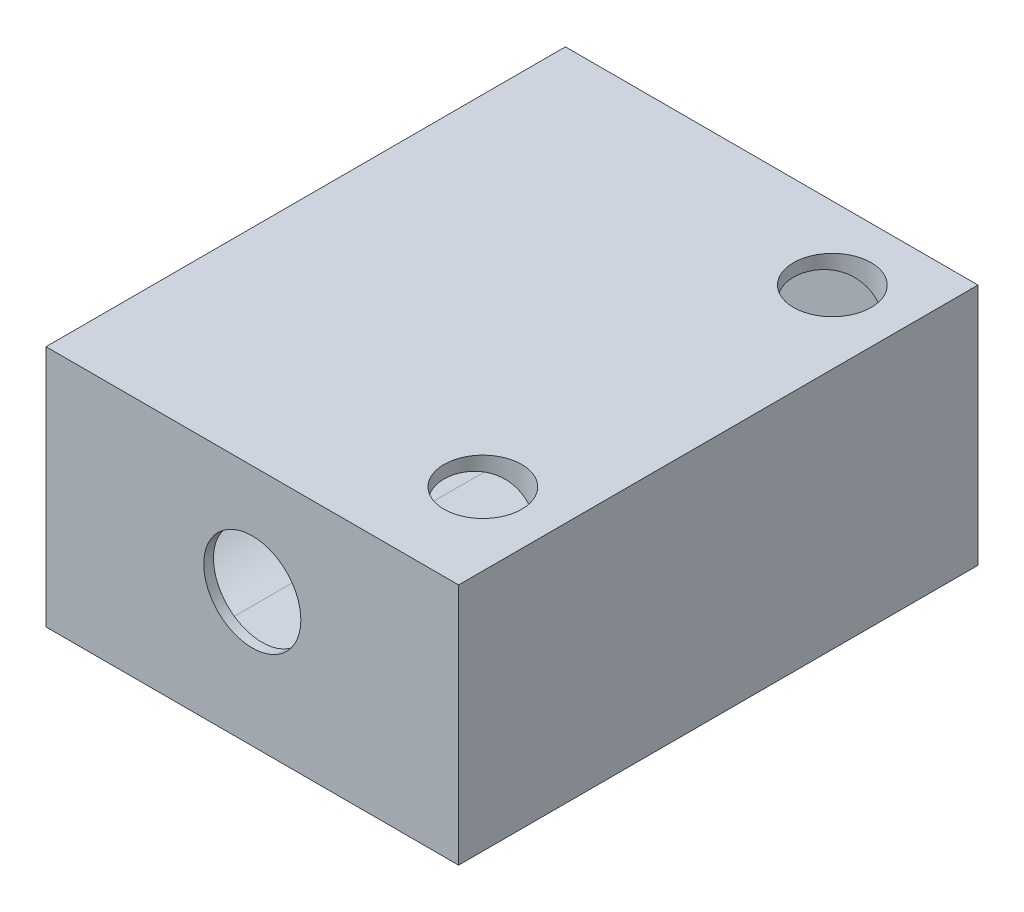
ISO-10303-21;
HEADER;
FILE_DESCRIPTION(('STEP AP214'),'2;1');
FILE_NAME('part.step','',(''),(''),'','','');
FILE_SCHEMA(('AUTOMOTIVE_DESIGN { 1 0 10303 214 1 1 1 1 }'));
ENDSEC;
DATA;
#1=APPLICATION_CONTEXT('core data for automotive mechanical design processes');
#2=APPLICATION_PROTOCOL_DEFINITION('international standard','automotive_design',2000,#1);
#3=PRODUCT_CONTEXT('',#1,'mechanical');
#4=PRODUCT('Part','Part','',(#3));
#5=PRODUCT_RELATED_PRODUCT_CATEGORY('part','',(#4));
#6=PRODUCT_DEFINITION_FORMATION('','',#4);
#7=PRODUCT_DEFINITION_CONTEXT('part definition',#1,'design');
#8=PRODUCT_DEFINITION('design','',#6,#7);
#9=PRODUCT_DEFINITION_SHAPE('','',#8);
#10=(LENGTH_UNIT() NAMED_UNIT(*) SI_UNIT(.MILLI.,.METRE.));
#11=(NAMED_UNIT(*) PLANE_ANGLE_UNIT() SI_UNIT($,.RADIAN.));
#12=(NAMED_UNIT(*) SI_UNIT($,.STERADIAN.) SOLID_ANGLE_UNIT());
#13=UNCERTAINTY_MEASURE_WITH_UNIT(LENGTH_MEASURE(1.E-05),#10,'distance_accuracy_value','');
#14=(GEOMETRIC_REPRESENTATION_CONTEXT(3) GLOBAL_UNCERTAINTY_ASSIGNED_CONTEXT((#13)) GLOBAL_UNIT_ASSIGNED_CONTEXT((#10,
#11,#12)) REPRESENTATION_CONTEXT('',''));
#15=CARTESIAN_POINT('',(0.,0.,0.));
#16=DIRECTION('',(0.,0.,1.));
#17=DIRECTION('',(1.,0.,0.));
#18=AXIS2_PLACEMENT_3D('',#15,#16,#17);
#19=CARTESIAN_POINT('',(0.,63.5,133.35));
#20=DIRECTION('',(0.,-1.,0.));
#21=DIRECTION('',(0.,0.,-1.));
#22=AXIS2_PLACEMENT_3D('',#19,#20,#21);
#23=PLANE('',#22);
#24=DIRECTION('',(0.,0.,-1.));
#25=VECTOR('',#24,1.);
#26=CARTESIAN_POINT('',(107.95,63.5,133.35));
#27=LINE('',#26,#25);
#28=CARTESIAN_POINT('',(107.95,63.5,135.89));
#29=VERTEX_POINT('',#28);
#30=CARTESIAN_POINT('',(107.95,63.5,0.));
#31=VERTEX_POINT('',#30);
#32=EDGE_CURVE('E58',#29,#31,#27,.T.);
#33=ORIENTED_EDGE('',*,*,#32,.T.);
#34=DIRECTION('',(-1.,0.,0.));
#35=VECTOR('',#34,1.);
#36=CARTESIAN_POINT('',(0.,63.5,0.));
#37=LINE('',#36,#35);
#38=CARTESIAN_POINT('',(0.,63.5,0.));
#39=VERTEX_POINT('',#38);
#40=EDGE_CURVE('E168',#31,#39,#37,.T.);
#41=ORIENTED_EDGE('',*,*,#40,.T.);
#42=DIRECTION('',(0.,0.,-1.));
#43=VECTOR('',#42,1.);
#44=CARTESIAN_POINT('',(0.,63.5,133.35));
#45=LINE('',#44,#43);
#46=CARTESIAN_POINT('',(0.,63.5,135.89));
#47=VERTEX_POINT('',#46);
#48=EDGE_CURVE('E51',#47,#39,#45,.T.);
#49=ORIENTED_EDGE('',*,*,#48,.F.);
#50=DIRECTION('',(-1.,0.,0.));
#51=VECTOR('',#50,1.);
#52=CARTESIAN_POINT('',(0.,63.5,135.89));
#53=LINE('',#52,#51);
#54=EDGE_CURVE('E117',#29,#47,#53,.T.);
#55=ORIENTED_EDGE('',*,*,#54,.F.);
#56=EDGE_LOOP('',(#33,#41,#49,#55));
#57=FACE_BOUND('',#56,.T.);
#58=CARTESIAN_POINT('',(88.9,63.5,19.05));
#59=DIRECTION('',(0.,-1.,0.));
#60=DIRECTION('',(0.,0.,-1.));
#61=AXIS2_PLACEMENT_3D('',#58,#59,#60);
#62=CIRCLE('',#61,10.16);
#63=CARTESIAN_POINT('',(88.9,63.5,8.89000000000001));
#64=VERTEX_POINT('',#63);
#65=EDGE_CURVE('E184',#64,#64,#62,.T.);
#66=ORIENTED_EDGE('',*,*,#65,.T.);
#67=EDGE_LOOP('',(#66));
#68=FACE_BOUND('',#67,.T.);
#69=CARTESIAN_POINT('',(88.9,63.5,110.49));
#70=DIRECTION('',(0.,-1.,0.));
#71=DIRECTION('',(0.,0.,-1.));
#72=AXIS2_PLACEMENT_3D('',#69,#70,#71);
#73=CIRCLE('',#72,10.16);
#74=CARTESIAN_POINT('',(88.9,63.5,100.33));
#75=VERTEX_POINT('',#74);
#76=EDGE_CURVE('E187',#75,#75,#73,.T.);
#77=ORIENTED_EDGE('',*,*,#76,.T.);
#78=EDGE_LOOP('',(#77));
#79=FACE_BOUND('',#78,.T.);
#80=ADVANCED_FACE('F36',(#57,#68,#79),#23,.F.);
#81=CARTESIAN_POINT('',(76.2,34.925,5.08));
#82=DIRECTION('',(0.,0.,1.));
#83=DIRECTION('',(1.,0.,0.));
#84=AXIS2_PLACEMENT_3D('',#81,#82,#83);
#85=CYLINDRICAL_SURFACE('',#84,25.4);
#86=CARTESIAN_POINT('',(76.2,34.925,133.35));
#87=DIRECTION('',(0.,0.,1.));
#88=DIRECTION('',(1.,0.,0.));
#89=AXIS2_PLACEMENT_3D('',#86,#87,#88);
#90=CIRCLE('',#89,25.4);
#91=CARTESIAN_POINT('',(76.2,9.525,133.35));
#92=VERTEX_POINT('',#91);
#93=CARTESIAN_POINT('',(76.2,60.325,133.35));
#94=VERTEX_POINT('',#93);
#95=EDGE_CURVE('E147',#92,#94,#90,.T.);
#96=ORIENTED_EDGE('',*,*,#95,.T.);
#97=DIRECTION('',(0.,0.,1.));
#98=VECTOR('',#97,1.);
#99=CARTESIAN_POINT('',(76.2,60.325,5.08));
#100=LINE('',#99,#98);
#101=CARTESIAN_POINT('',(76.2,60.325,5.08));
#102=VERTEX_POINT('',#101);
#103=EDGE_CURVE('E155',#102,#94,#100,.T.);
#104=ORIENTED_EDGE('',*,*,#103,.F.);
#105=CARTESIAN_POINT('',(76.2,34.925,5.08));
#106=DIRECTION('',(0.,0.,1.));
#107=DIRECTION('',(1.,0.,0.));
#108=AXIS2_PLACEMENT_3D('',#105,#106,#107);
#109=CIRCLE('',#108,25.4);
#110=CARTESIAN_POINT('',(76.2,9.525,5.08));
#111=VERTEX_POINT('',#110);
#112=EDGE_CURVE('E135',#111,#102,#109,.T.);
#113=ORIENTED_EDGE('',*,*,#112,.F.);
#114=DIRECTION('',(0.,0.,1.));
#115=VECTOR('',#114,1.);
#116=CARTESIAN_POINT('',(76.2,9.525,5.08));
#117=LINE('',#116,#115);
#118=EDGE_CURVE('E158',#111,#92,#117,.T.);
#119=ORIENTED_EDGE('',*,*,#118,.T.);
#120=EDGE_LOOP('',(#96,#104,#113,#119));
#121=FACE_BOUND('',#120,.T.);
#122=CARTESIAN_POINT('',(88.9,56.9220452561247,29.21));
#123=CARTESIAN_POINT('',(89.2756064943384,56.7051828705063,29.2099971108957));
#124=CARTESIAN_POINT('',(89.6457040129703,56.4786402854941,29.1891538820678));
#125=CARTESIAN_POINT('',(90.3709839206902,56.0088848283402,29.1095761465608));
#126=CARTESIAN_POINT('',(90.7261589274956,55.765663858291,29.0508231153214));
#127=CARTESIAN_POINT('',(91.41968340898,55.2647303194378,28.8990145423729));
#128=CARTESIAN_POINT('',(91.7579925678835,55.0069858963736,28.8058808985446));
#129=CARTESIAN_POINT('',(92.4151930823998,54.480176888362,28.5888050191749));
#130=CARTESIAN_POINT('',(92.7340857910189,54.2111130944026,28.4648649334003));
#131=CARTESIAN_POINT('',(93.3890746049134,53.63087234748,28.1723704769345));
#132=CARTESIAN_POINT('',(93.7225502878889,53.3185518145697,28.0002243695954));
#133=CARTESIAN_POINT('',(94.363261393526,52.6861552742099,27.6241722844393));
#134=CARTESIAN_POINT('',(94.6704901249804,52.3660773156771,27.4202582451249));
#135=CARTESIAN_POINT('',(95.2584064363175,51.7216492867779,26.9828785151929));
#136=CARTESIAN_POINT('',(95.5390873389074,51.397298164876,26.7494054242512));
#137=CARTESIAN_POINT('',(96.0735652993716,50.7483342516919,26.2540514584397));
#138=CARTESIAN_POINT('',(96.3273714984814,50.4237215874721,25.9921803047103));
#139=CARTESIAN_POINT('',(96.7374579953752,49.8733702170923,25.5204596688597));
#140=CARTESIAN_POINT('',(96.9005443807741,49.6464934017825,25.3178095435435));
#141=CARTESIAN_POINT('',(97.2128405661613,49.1971872244416,24.8972996835076));
#142=CARTESIAN_POINT('',(97.362048562285,48.9747584434917,24.6794379780645));
#143=CARTESIAN_POINT('',(97.6456460428541,48.5379305257614,24.2278580150196));
#144=CARTESIAN_POINT('',(97.7800712215749,48.3235129113706,23.9941802556868));
#145=CARTESIAN_POINT('',(98.0334588131405,47.9065062324312,23.5087520361313));
#146=CARTESIAN_POINT('',(98.1524313888686,47.7039094423448,23.2570136249382));
#147=CARTESIAN_POINT('',(98.3766110667288,47.3109003337332,22.7249559196767));
#148=CARTESIAN_POINT('',(98.4813014506497,47.1210320207692,22.4440079132311));
#149=CARTESIAN_POINT('',(98.669332408164,46.7710304828614,21.8572314294573));
#150=CARTESIAN_POINT('',(98.7526917768122,46.6108711154264,21.5514251703704));
#151=CARTESIAN_POINT('',(98.8791923246017,46.3630874445159,20.9761070863874));
#152=CARTESIAN_POINT('',(98.9270146680982,46.2673980036928,20.7112375381001));
#153=CARTESIAN_POINT('',(98.9832850228293,46.1536995731761,20.3037181706426));
#154=CARTESIAN_POINT('',(98.9994613027101,46.1207797766696,20.1662317095338));
#155=CARTESIAN_POINT('',(99.0262927906815,46.0659738690749,19.8885755414238));
#156=CARTESIAN_POINT('',(99.0369507464435,46.0440822670005,19.7484072058979));
#157=CARTESIAN_POINT('',(99.0525155058693,46.0120581828956,19.4651280654644));
#158=CARTESIAN_POINT('',(99.0573699743768,46.0020327161812,19.3220021526617));
#159=CARTESIAN_POINT('',(99.0610003509738,45.9945384593369,19.0353445437131));
#160=CARTESIAN_POINT('',(99.0597764490076,45.9970692768328,18.8918128603872));
#161=CARTESIAN_POINT('',(99.0512868837509,46.0145797815046,18.6056041119924));
#162=CARTESIAN_POINT('',(99.0440172029994,46.0295677465356,18.462927678758));
#163=CARTESIAN_POINT('',(99.0236564733302,46.0713554029627,18.179744714585));
#164=CARTESIAN_POINT('',(99.010564660355,46.0981566446499,18.0392384709527));
#165=CARTESIAN_POINT('',(98.9766209760811,46.1672071039272,17.7412040278355));
#166=CARTESIAN_POINT('',(98.9549189620956,46.2111331490899,17.5841629239453));
#167=CARTESIAN_POINT('',(98.9049832254668,46.3112573976683,17.2750463901184));
#168=CARTESIAN_POINT('',(98.8767446997546,46.36746462366,17.1229747059729));
#169=CARTESIAN_POINT('',(98.8143391343334,46.4903106984,16.824052377869));
#170=CARTESIAN_POINT('',(98.7801608501946,46.5569693085989,16.6772122847813));
#171=CARTESIAN_POINT('',(98.7065155467252,46.6988336360371,16.389183395694));
#172=CARTESIAN_POINT('',(98.667049555823,46.774037690806,16.2479935076798));
#173=CARTESIAN_POINT('',(98.5525245034215,46.9893474630746,15.8692055035002));
#174=CARTESIAN_POINT('',(98.47263437552,47.1365098074085,15.6370678623276));
#175=CARTESIAN_POINT('',(98.3003496506784,47.4456208915507,15.1877498531487));
#176=CARTESIAN_POINT('',(98.2079454543645,47.6075809511498,14.9705811625127));
#177=CARTESIAN_POINT('',(98.0116698721126,47.9422500395963,14.5491990583053));
#178=CARTESIAN_POINT('',(97.9077694264238,48.1149858034193,14.3450206295346));
#179=CARTESIAN_POINT('',(97.689534691375,48.4676331657081,13.9489421411727));
#180=CARTESIAN_POINT('',(97.5752021427711,48.6475435641661,13.7570400421459));
#181=CARTESIAN_POINT('',(97.3536199153307,48.9862692446863,13.4110407760062));
#182=CARTESIAN_POINT('',(97.2476862836542,49.1444329066395,13.255455664535));
#183=CARTESIAN_POINT('',(97.028709249952,49.4633051324441,12.9520765419754));
#184=CARTESIAN_POINT('',(96.9156649906126,49.6240140014113,12.8042834743218));
#185=CARTESIAN_POINT('',(96.5659650994769,50.1087431654909,12.3719623744887));
#186=CARTESIAN_POINT('',(96.3188105101,50.4352608704305,12.0985980821109));
#187=CARTESIAN_POINT('',(95.7972414777195,51.0892590857281,11.5808244154494));
#188=CARTESIAN_POINT('',(95.5228300220551,51.4167394867657,11.3364118744916));
#189=CARTESIAN_POINT('',(94.9469803042436,52.0685030692007,10.8771691977255));
#190=CARTESIAN_POINT('',(94.645552097278,52.3927873906574,10.6623281307802));
#191=CARTESIAN_POINT('',(94.0618947428393,52.9876726422036,10.2931981468793));
#192=CARTESIAN_POINT('',(93.7832938555874,53.2591952791736,10.1346483625132));
#193=CARTESIAN_POINT('',(93.2068263863727,53.7951536822748,9.84232512593481));
#194=CARTESIAN_POINT('',(92.9089592020441,54.0595892264603,9.70855244889102));
#195=CARTESIAN_POINT('',(92.2951403543418,54.5786957670121,9.46840048898047));
#196=CARTESIAN_POINT('',(91.9792196428485,54.8333822954789,9.36197594511035));
#197=CARTESIAN_POINT('',(91.330008895249,55.3311261505632,9.17911813065657));
#198=CARTESIAN_POINT('',(90.9967232699172,55.5741864005168,9.10267728573027));
#199=CARTESIAN_POINT('',(90.3878902171245,55.9955939067846,8.99586097222574));
#200=CARTESIAN_POINT('',(90.1153112364065,56.176630138223,8.95911863187853));
#201=CARTESIAN_POINT('',(89.5618741625214,56.5288847547407,8.90777545245065));
#202=CARTESIAN_POINT('',(89.2810179119022,56.7001053002014,8.89316972307568));
#203=CARTESIAN_POINT('',(88.7126869350535,57.0315796288272,8.88775356474215));
#204=CARTESIAN_POINT('',(88.4252130016917,57.1918347167235,8.89694029975242));
#205=CARTESIAN_POINT('',(87.8457234870526,57.5003149992494,8.94067176643667));
#206=CARTESIAN_POINT('',(87.5537078353816,57.6485400071987,8.97521689153299));
#207=CARTESIAN_POINT('',(86.9654124943004,57.9331177597402,9.07139851172101));
#208=CARTESIAN_POINT('',(86.6691173308218,58.0693680024776,9.13324586422569));
#209=CARTESIAN_POINT('',(86.0776188941102,58.3279232720227,9.28511484375721));
#210=CARTESIAN_POINT('',(85.782415638648,58.4502280728252,9.37513692730591));
#211=CARTESIAN_POINT('',(85.1967203153096,58.6803779641358,9.58385438195323));
#212=CARTESIAN_POINT('',(84.9062257916169,58.7882308202307,9.7025342572672));
#213=CARTESIAN_POINT('',(84.3334874821739,58.9894653153909,9.96857833251592));
#214=CARTESIAN_POINT('',(84.051242542596,59.082848986122,10.1159384987891));
#215=CARTESIAN_POINT('',(83.5342884388332,59.2443726054499,10.4179377581312));
#216=CARTESIAN_POINT('',(83.2981334280004,59.3142144967355,10.5692046489652));
#217=CARTESIAN_POINT('',(82.8373352556371,59.4436263883745,10.892252470913));
#218=CARTESIAN_POINT('',(82.612691018762,59.5031973494797,11.0640314807582));
#219=CARTESIAN_POINT('',(82.1772200471305,59.6127148391075,11.4269971910049));
#220=CARTESIAN_POINT('',(81.9663913349927,59.6626627469476,11.6181811040031));
#221=CARTESIAN_POINT('',(81.5606041741748,59.7537570445246,12.0186331195242));
#222=CARTESIAN_POINT('',(81.3656456348606,59.7949034845286,12.2279011187555));
#223=CARTESIAN_POINT('',(81.0024347416304,59.8675192169474,12.6524753915717));
#224=CARTESIAN_POINT('',(80.833348650777,59.8993589470173,12.8670063103296));
#225=CARTESIAN_POINT('',(80.5126631454301,59.9567294117257,13.3095431744139));
#226=CARTESIAN_POINT('',(80.3610629840792,59.9822604158751,13.5375485435911));
#227=CARTESIAN_POINT('',(80.0765573680894,60.0278498219865,14.0054550575945));
#228=CARTESIAN_POINT('',(79.9436519433405,60.0479082151987,14.2453562214394));
#229=CARTESIAN_POINT('',(79.6975545144224,60.0833500132714,14.7353994518322));
#230=CARTESIAN_POINT('',(79.584362972459,60.0987333085273,14.985541758321));
#231=CARTESIAN_POINT('',(79.3769153075623,60.1257605381,15.4983580188325));
#232=CARTESIAN_POINT('',(79.2829854321114,60.1373417734672,15.761167282155));
#233=CARTESIAN_POINT('',(79.1170343667734,60.1570807370006,16.2937381613989));
#234=CARTESIAN_POINT('',(79.045013319039,60.1652384429538,16.5634998224177));
#235=CARTESIAN_POINT('',(78.9233984981144,60.1786501955276,17.1081246123851));
#236=CARTESIAN_POINT('',(78.873806495892,60.1839040128683,17.3829881423873));
#237=CARTESIAN_POINT('',(78.7974125488634,60.1918740591546,17.9359010622974));
#238=CARTESIAN_POINT('',(78.7706107973335,60.1945902665797,18.2139504792033));
#239=CARTESIAN_POINT('',(78.7397546132745,60.1977104880273,18.7755783276775));
#240=CARTESIAN_POINT('',(78.7360532651692,60.198078614014,19.0591764185212));
#241=CARTESIAN_POINT('',(78.7523653815551,60.1964363770043,19.625685043111));
#242=CARTESIAN_POINT('',(78.7723791148863,60.1944259870446,19.9085955690263));
#243=CARTESIAN_POINT('',(78.8359773848197,60.1878708395569,20.4717405371529));
#244=CARTESIAN_POINT('',(78.8795631109675,60.1833259541269,20.7519748435843));
#245=CARTESIAN_POINT('',(78.9899858416449,60.1713672362724,21.3077626537361));
#246=CARTESIAN_POINT('',(79.0568228089594,60.1639534084398,21.5833161649478));
#247=CARTESIAN_POINT('',(79.2134250516176,60.1457353545876,22.1283842695534));
#248=CARTESIAN_POINT('',(79.3032412359694,60.1349235883429,22.3978839901229));
#249=CARTESIAN_POINT('',(79.5050424270874,60.1092615970078,22.9282567902022));
#250=CARTESIAN_POINT('',(79.6170275149741,60.0944113571397,23.1891298381412));
#251=CARTESIAN_POINT('',(79.8622793665319,60.0598967494068,23.700329966551));
#252=CARTESIAN_POINT('',(79.9955451555955,60.040232601986,23.9506575293178));
#253=CARTESIAN_POINT('',(80.2822748105904,59.9952229860919,24.4389297735188));
#254=CARTESIAN_POINT('',(80.4357384434966,59.9698775831615,24.67687459777));
#255=CARTESIAN_POINT('',(80.7599526182623,59.9128699094875,25.1363372787523));
#256=CARTESIAN_POINT('',(80.9305177000761,59.8812724178188,25.3579940253055));
#257=CARTESIAN_POINT('',(81.2886897836528,59.8107095290704,25.7858284422451));
#258=CARTESIAN_POINT('',(81.4762966392968,59.7717441951608,25.9920062453227));
#259=CARTESIAN_POINT('',(81.8668068035582,59.6855988807196,26.387368458814));
#260=CARTESIAN_POINT('',(82.0697063532601,59.6384209151278,26.5765570202588));
#261=CARTESIAN_POINT('',(82.4889397348108,59.5350757706143,26.9367147472536));
#262=CARTESIAN_POINT('',(82.7052733690095,59.4789087239261,27.1076841807536));
#263=CARTESIAN_POINT('',(83.1447767091839,59.3581934069234,27.4270694788249));
#264=CARTESIAN_POINT('',(83.3677178329537,59.2938388723733,27.5758733860838));
#265=CARTESIAN_POINT('',(83.8224171843216,59.1554605688033,27.8542496673916));
#266=CARTESIAN_POINT('',(84.0541751431644,59.0814370943455,27.9838226270499));
#267=CARTESIAN_POINT('',(84.5243685604864,58.9234663281465,28.2232793987985));
#268=CARTESIAN_POINT('',(84.7628038668729,58.8395192622989,28.333163658925));
#269=CARTESIAN_POINT('',(85.2442264123359,58.6616348134266,28.5330832469592));
#270=CARTESIAN_POINT('',(85.4872139357351,58.5676968046616,28.6231173305488));
#271=CARTESIAN_POINT('',(85.9957585755818,58.3618170482957,28.7900390401925));
#272=CARTESIAN_POINT('',(86.2615286543937,58.2490300541289,28.8652369895719));
#273=CARTESIAN_POINT('',(86.7935047531233,58.012278857991,28.9929940051144));
#274=CARTESIAN_POINT('',(87.0597107852422,57.8883143377572,29.0455524264055));
#275=CARTESIAN_POINT('',(87.5905184473178,57.6296974331842,29.1288428107024));
#276=CARTESIAN_POINT('',(87.8551190368665,57.4950387798695,29.1595618647461));
#277=CARTESIAN_POINT('',(88.3806824939309,57.2157967610294,29.2001440356899));
#278=CARTESIAN_POINT('',(88.6416444446067,57.0712109466144,29.2100019872291));
#279=CARTESIAN_POINT('',(88.9,56.9220452561247,29.21));
#280=B_SPLINE_CURVE_WITH_KNOTS('',3,(#122,#123,#124,#125,#126,#127,#128,#129,#130,#131,#132,
#133,#134,#135,#136,#137,#138,#139,#140,#141,#142,#143,#144,#145,#146,#147,#148,#149,#150,#151,
#152,#153,#154,#155,#156,#157,#158,#159,#160,#161,#162,#163,#164,#165,#166,#167,#168,#169,#170,
#171,#172,#173,#174,#175,#176,#177,#178,#179,#180,#181,#182,#183,#184,#185,#186,#187,#188,#189,
#190,#191,#192,#193,#194,#195,#196,#197,#198,#199,#200,#201,#202,#203,#204,#205,#206,#207,#208,
#209,#210,#211,#212,#213,#214,#215,#216,#217,#218,#219,#220,#221,#222,#223,#224,#225,#226,#227,
#228,#229,#230,#231,#232,#233,#234,#235,#236,#237,#238,#239,#240,#241,#242,#243,#244,#245,#246,
#247,#248,#249,#250,#251,#252,#253,#254,#255,#256,#257,#258,#259,#260,#261,#262,#263,#264,#265,
#266,#267,#268,#269,#270,#271,#272,#273,#274,#275,#276,#277,#278,#279),.UNSPECIFIED.,.T.,.F.,(4,
2,2,2,2,2,2,2,2,2,2,2,2,2,2,2,2,2,2,2,2,2,2,2,2,2,2,2,2,2,2,2,2,2,2,2,2,2,2,2,2,2,2,2,2,2,2,2,2,
2,2,2,2,2,2,2,2,2,2,2,2,2,2,2,2,2,2,2,2,2,2,2,2,2,2,2,2,2,4),(0.,1.30072856917739,
2.60209321899665,3.9064325441345,5.21068087407055,6.67346158166679,8.13661409403641,
9.60013364437011,11.0631537791185,12.098081765003,13.1331440797851,14.1656495808151,
15.1974725465255,16.2600861110007,17.3217601426648,18.1752428003757,18.6016503041462,
19.0278452873975,19.4578553337559,19.8878519427177,20.3181345158645,20.7484735730787,
21.2412323828619,21.7343544307523,22.2284203737978,22.7223903629986,23.5796335921125,
24.4375381655058,25.2976631180087,26.1576448070635,26.8949547244452,27.6323537088067,
29.1076417478262,30.5827682740426,32.0573480448018,33.3165089578595,34.5757092579627,
35.8328119685732,37.0895969109073,38.0765254905801,39.0632360118039,40.049828923815,
41.0364371426302,42.0308020876118,43.0251831453589,44.0190277226306,45.0127326242091,
45.878666965956,46.7445202634504,47.6102493616222,48.4759735152991,49.3000315554632,
50.1240543854897,50.9480785329831,51.7721219976922,52.6091418051269,53.4461670433416,
54.2832583604331,55.1203567765323,55.970219335212,56.820091528237,57.6700066135285,
58.5199203384862,59.3717335494655,60.2235498774615,61.0753272053914,61.9270947071165,
62.7704599467345,63.6138179558815,64.4569693410272,65.3001083241732,66.1260959243391,
66.9520583668532,67.7780020113654,68.6039974158437,69.497910091815,70.3918482286166,
71.2863143221383,72.1810018660736),.UNSPECIFIED.);
#281=CARTESIAN_POINT('',(88.9,56.9220452561247,29.21));
#282=VERTEX_POINT('',#281);
#283=EDGE_CURVE('E189',#282,#282,#280,.T.);
#284=ORIENTED_EDGE('',*,*,#283,.T.);
#285=EDGE_LOOP('',(#284));
#286=FACE_BOUND('',#285,.T.);
#287=CARTESIAN_POINT('',(88.9,56.9220452561247,120.65));
#288=CARTESIAN_POINT('',(89.2756064943384,56.7051828705063,120.649997110896));
#289=CARTESIAN_POINT('',(89.6457040129703,56.4786402854941,120.629153882068));
#290=CARTESIAN_POINT('',(90.3709839206902,56.0088848283403,120.549576146561));
#291=CARTESIAN_POINT('',(90.7261589274956,55.765663858291,120.490823115321));
#292=CARTESIAN_POINT('',(91.41968340898,55.2647303194378,120.339014542373));
#293=CARTESIAN_POINT('',(91.7579925678835,55.0069858963736,120.245880898545));
#294=CARTESIAN_POINT('',(92.4151930823998,54.480176888362,120.028805019175));
#295=CARTESIAN_POINT('',(92.7340857910189,54.2111130944026,119.9048649334));
#296=CARTESIAN_POINT('',(93.3890746049134,53.63087234748,119.612370476935));
#297=CARTESIAN_POINT('',(93.7225502878889,53.3185518145697,119.440224369595));
#298=CARTESIAN_POINT('',(94.363261393526,52.6861552742099,119.064172284439));
#299=CARTESIAN_POINT('',(94.6704901249804,52.3660773156771,118.860258245125));
#300=CARTESIAN_POINT('',(95.2584064363175,51.7216492867778,118.422878515193));
#301=CARTESIAN_POINT('',(95.5390873389074,51.397298164876,118.189405424251));
#302=CARTESIAN_POINT('',(96.0735652993716,50.7483342516919,117.69405145844));
#303=CARTESIAN_POINT('',(96.3273714984814,50.4237215874721,117.43218030471));
#304=CARTESIAN_POINT('',(96.7374579953752,49.8733702170922,116.96045966886));
#305=CARTESIAN_POINT('',(96.9005443807741,49.6464934017825,116.757809543544));
#306=CARTESIAN_POINT('',(97.2128405661613,49.1971872244416,116.337299683508));
#307=CARTESIAN_POINT('',(97.362048562285,48.9747584434917,116.119437978064));
#308=CARTESIAN_POINT('',(97.6456460428541,48.5379305257614,115.66785801502));
#309=CARTESIAN_POINT('',(97.7800712215749,48.3235129113706,115.434180255687));
#310=CARTESIAN_POINT('',(98.0334588131405,47.9065062324312,114.948752036131));
#311=CARTESIAN_POINT('',(98.1524313888686,47.7039094423448,114.697013624938));
#312=CARTESIAN_POINT('',(98.3766110667288,47.3109003337332,114.164955919677));
#313=CARTESIAN_POINT('',(98.4813014506497,47.1210320207692,113.884007913231));
#314=CARTESIAN_POINT('',(98.669332408164,46.7710304828614,113.297231429457));
#315=CARTESIAN_POINT('',(98.7526917768122,46.6108711154264,112.99142517037));
#316=CARTESIAN_POINT('',(98.8791923246017,46.3630874445159,112.416107086387));
#317=CARTESIAN_POINT('',(98.9270146680982,46.2673980036928,112.1512375381));
#318=CARTESIAN_POINT('',(98.9832850228293,46.1536995731761,111.743718170643));
#319=CARTESIAN_POINT('',(98.9994613027101,46.1207797766696,111.606231709534));
#320=CARTESIAN_POINT('',(99.0262927906815,46.0659738690749,111.328575541424));
#321=CARTESIAN_POINT('',(99.0369507464435,46.0440822670005,111.188407205898));
#322=CARTESIAN_POINT('',(99.0525155058693,46.0120581828956,110.905128065464));
#323=CARTESIAN_POINT('',(99.0573699743768,46.0020327161812,110.762002152662));
#324=CARTESIAN_POINT('',(99.0610003509738,45.9945384593369,110.475344543713));
#325=CARTESIAN_POINT('',(99.0597764490076,45.9970692768328,110.331812860387));
#326=CARTESIAN_POINT('',(99.0512868837509,46.0145797815046,110.045604111992));
#327=CARTESIAN_POINT('',(99.0440172029994,46.0295677465356,109.902927678758));
#328=CARTESIAN_POINT('',(99.0236564733302,46.0713554029627,109.619744714585));
#329=CARTESIAN_POINT('',(99.010564660355,46.0981566446499,109.479238470953));
#330=CARTESIAN_POINT('',(98.9766209760811,46.1672071039272,109.181204027836));
#331=CARTESIAN_POINT('',(98.9549189620956,46.2111331490899,109.024162923945));
#332=CARTESIAN_POINT('',(98.9049832254668,46.3112573976683,108.715046390118));
#333=CARTESIAN_POINT('',(98.8767446997546,46.36746462366,108.562974705973));
#334=CARTESIAN_POINT('',(98.8143391343334,46.4903106984,108.264052377869));
#335=CARTESIAN_POINT('',(98.7801608501946,46.5569693085989,108.117212284781));
#336=CARTESIAN_POINT('',(98.7065155467252,46.698833636037,107.829183395694));
#337=CARTESIAN_POINT('',(98.667049555823,46.774037690806,107.68799350768));
#338=CARTESIAN_POINT('',(98.5525245034215,46.9893474630746,107.3092055035));
#339=CARTESIAN_POINT('',(98.47263437552,47.1365098074085,107.077067862328));
#340=CARTESIAN_POINT('',(98.3003496506784,47.4456208915507,106.627749853149));
#341=CARTESIAN_POINT('',(98.2079454543645,47.6075809511498,106.410581162513));
#342=CARTESIAN_POINT('',(98.0116698721126,47.9422500395963,105.989199058305));
#343=CARTESIAN_POINT('',(97.9077694264238,48.1149858034193,105.785020629535));
#344=CARTESIAN_POINT('',(97.689534691375,48.4676331657081,105.388942141173));
#345=CARTESIAN_POINT('',(97.5752021427712,48.6475435641661,105.197040042146));
#346=CARTESIAN_POINT('',(97.3536199153308,48.9862692446863,104.851040776006));
#347=CARTESIAN_POINT('',(97.2476862836542,49.1444329066395,104.695455664535));
#348=CARTESIAN_POINT('',(97.028709249952,49.463305132444,104.392076541975));
#349=CARTESIAN_POINT('',(96.9156649906126,49.6240140014113,104.244283474322));
#350=CARTESIAN_POINT('',(96.5659650994769,50.1087431654908,103.811962374489));
#351=CARTESIAN_POINT('',(96.3188105101,50.4352608704305,103.538598082111));
#352=CARTESIAN_POINT('',(95.7972414777196,51.0892590857281,103.020824415449));
#353=CARTESIAN_POINT('',(95.5228300220551,51.4167394867657,102.776411874492));
#354=CARTESIAN_POINT('',(94.9469803042437,52.0685030692006,102.317169197725));
#355=CARTESIAN_POINT('',(94.645552097278,52.3927873906573,102.10232813078));
#356=CARTESIAN_POINT('',(94.0618947428393,52.9876726422036,101.733198146879));
#357=CARTESIAN_POINT('',(93.7832938555874,53.2591952791735,101.574648362513));
#358=CARTESIAN_POINT('',(93.2068263863728,53.7951536822747,101.282325125935));
#359=CARTESIAN_POINT('',(92.9089592020441,54.0595892264602,101.148552448891));
#360=CARTESIAN_POINT('',(92.2951403543419,54.578695767012,100.90840048898));
#361=CARTESIAN_POINT('',(91.9792196428486,54.8333822954788,100.80197594511));
#362=CARTESIAN_POINT('',(91.3300088952491,55.3311261505631,100.619118130657));
#363=CARTESIAN_POINT('',(90.9967232699173,55.5741864005168,100.54267728573));
#364=CARTESIAN_POINT('',(90.3878902171245,55.9955939067845,100.435860972226));
#365=CARTESIAN_POINT('',(90.1153112364066,56.1766301382229,100.399118631879));
#366=CARTESIAN_POINT('',(89.5618741625215,56.5288847547406,100.347775452451));
#367=CARTESIAN_POINT('',(89.2810179119022,56.7001053002013,100.333169723076));
#368=CARTESIAN_POINT('',(88.7126869350536,57.0315796288271,100.327753564742));
#369=CARTESIAN_POINT('',(88.4252130016918,57.1918347167235,100.336940299752));
#370=CARTESIAN_POINT('',(87.8457234870526,57.5003149992493,100.380671766437));
#371=CARTESIAN_POINT('',(87.5537078353817,57.6485400071986,100.415216891533));
#372=CARTESIAN_POINT('',(86.9654124943005,57.9331177597402,100.511398511721));
#373=CARTESIAN_POINT('',(86.6691173308218,58.0693680024775,100.573245864226));
#374=CARTESIAN_POINT('',(86.0776188941102,58.3279232720226,100.725114843757));
#375=CARTESIAN_POINT('',(85.7824156386481,58.4502280728252,100.815136927306));
#376=CARTESIAN_POINT('',(85.1967203153096,58.6803779641357,101.023854381953));
#377=CARTESIAN_POINT('',(84.906225791617,58.7882308202307,101.142534257267));
#378=CARTESIAN_POINT('',(84.3334874821739,58.9894653153909,101.408578332516));
#379=CARTESIAN_POINT('',(84.0512425425961,59.0828489861219,101.555938498789));
#380=CARTESIAN_POINT('',(83.5342884388333,59.2443726054499,101.857937758131));
#381=CARTESIAN_POINT('',(83.2981334280004,59.3142144967355,102.009204648965));
#382=CARTESIAN_POINT('',(82.8373352556372,59.4436263883745,102.332252470913));
#383=CARTESIAN_POINT('',(82.612691018762,59.5031973494797,102.504031480758));
#384=CARTESIAN_POINT('',(82.1772200471306,59.6127148391075,102.866997191005));
#385=CARTESIAN_POINT('',(81.9663913349928,59.6626627469476,103.058181104003));
#386=CARTESIAN_POINT('',(81.5606041741748,59.7537570445246,103.458633119524));
#387=CARTESIAN_POINT('',(81.3656456348606,59.7949034845286,103.667901118755));
#388=CARTESIAN_POINT('',(81.0024347416304,59.8675192169474,104.092475391572));
#389=CARTESIAN_POINT('',(80.833348650777,59.8993589470173,104.30700631033));
#390=CARTESIAN_POINT('',(80.5126631454301,59.9567294117257,104.749543174414));
#391=CARTESIAN_POINT('',(80.3610629840792,59.9822604158751,104.977548543591));
#392=CARTESIAN_POINT('',(80.0765573680894,60.0278498219865,105.445455057594));
#393=CARTESIAN_POINT('',(79.9436519433405,60.0479082151987,105.685356221439));
#394=CARTESIAN_POINT('',(79.6975545144225,60.0833500132714,106.175399451832));
#395=CARTESIAN_POINT('',(79.584362972459,60.0987333085273,106.425541758321));
#396=CARTESIAN_POINT('',(79.3769153075624,60.1257605381,106.938358018832));
#397=CARTESIAN_POINT('',(79.2829854321114,60.1373417734672,107.201167282155));
#398=CARTESIAN_POINT('',(79.1170343667734,60.1570807370006,107.733738161399));
#399=CARTESIAN_POINT('',(79.045013319039,60.1652384429538,108.003499822418));
#400=CARTESIAN_POINT('',(78.9233984981144,60.1786501955276,108.548124612385));
#401=CARTESIAN_POINT('',(78.873806495892,60.1839040128683,108.822988142387));
#402=CARTESIAN_POINT('',(78.7974125488635,60.1918740591546,109.375901062297));
#403=CARTESIAN_POINT('',(78.7706107973335,60.1945902665797,109.653950479203));
#404=CARTESIAN_POINT('',(78.7397546132745,60.1977104880273,110.215578327677));
#405=CARTESIAN_POINT('',(78.7360532651692,60.198078614014,110.499176418521));
#406=CARTESIAN_POINT('',(78.7523653815551,60.1964363770043,111.065685043111));
#407=CARTESIAN_POINT('',(78.7723791148863,60.1944259870446,111.348595569026));
#408=CARTESIAN_POINT('',(78.8359773848196,60.1878708395569,111.911740537153));
#409=CARTESIAN_POINT('',(78.8795631109674,60.1833259541269,112.191974843584));
#410=CARTESIAN_POINT('',(78.9899858416448,60.1713672362724,112.747762653736));
#411=CARTESIAN_POINT('',(79.0568228089594,60.1639534084398,113.023316164948));
#412=CARTESIAN_POINT('',(79.2134250516175,60.1457353545876,113.568384269553));
#413=CARTESIAN_POINT('',(79.3032412359694,60.1349235883429,113.837883990123));
#414=CARTESIAN_POINT('',(79.5050424270873,60.1092615970078,114.368256790202));
#415=CARTESIAN_POINT('',(79.617027514974,60.0944113571397,114.629129838141));
#416=CARTESIAN_POINT('',(79.8622793665319,60.0598967494068,115.140329966551));
#417=CARTESIAN_POINT('',(79.9955451555954,60.0402326019861,115.390657529318));
#418=CARTESIAN_POINT('',(80.2822748105904,59.9952229860919,115.878929773519));
#419=CARTESIAN_POINT('',(80.4357384434966,59.9698775831615,116.11687459777));
#420=CARTESIAN_POINT('',(80.7599526182623,59.9128699094875,116.576337278752));
#421=CARTESIAN_POINT('',(80.930517700076,59.8812724178188,116.797994025305));
#422=CARTESIAN_POINT('',(81.2886897836527,59.8107095290704,117.225828442245));
#423=CARTESIAN_POINT('',(81.4762966392967,59.7717441951608,117.432006245323));
#424=CARTESIAN_POINT('',(81.8668068035581,59.6855988807196,117.827368458814));
#425=CARTESIAN_POINT('',(82.06970635326,59.6384209151278,118.016557020259));
#426=CARTESIAN_POINT('',(82.4889397348107,59.5350757706143,118.376714747253));
#427=CARTESIAN_POINT('',(82.7052733690094,59.4789087239261,118.547684180753));
#428=CARTESIAN_POINT('',(83.1447767091838,59.3581934069234,118.867069478825));
#429=CARTESIAN_POINT('',(83.3677178329536,59.2938388723733,119.015873386084));
#430=CARTESIAN_POINT('',(83.8224171843215,59.1554605688034,119.294249667392));
#431=CARTESIAN_POINT('',(84.0541751431644,59.0814370943455,119.42382262705));
#432=CARTESIAN_POINT('',(84.5243685604864,58.9234663281465,119.663279398798));
#433=CARTESIAN_POINT('',(84.7628038668729,58.839519262299,119.773163658925));
#434=CARTESIAN_POINT('',(85.2442264123359,58.6616348134266,119.973083246959));
#435=CARTESIAN_POINT('',(85.487213935735,58.5676968046616,120.063117330549));
#436=CARTESIAN_POINT('',(85.9957585755817,58.3618170482957,120.230039040192));
#437=CARTESIAN_POINT('',(86.2615286543936,58.2490300541289,120.305236989572));
#438=CARTESIAN_POINT('',(86.7935047531233,58.0122788579911,120.432994005114));
#439=CARTESIAN_POINT('',(87.0597107852422,57.8883143377572,120.485552426405));
#440=CARTESIAN_POINT('',(87.5905184473178,57.6296974331842,120.568842810702));
#441=CARTESIAN_POINT('',(87.8551190368665,57.4950387798695,120.599561864746));
#442=CARTESIAN_POINT('',(88.3806824939308,57.2157967610294,120.64014403569));
#443=CARTESIAN_POINT('',(88.6416444446067,57.0712109466144,120.650001987229));
#444=CARTESIAN_POINT('',(88.9,56.9220452561247,120.65));
#445=B_SPLINE_CURVE_WITH_KNOTS('',3,(#287,#288,#289,#290,#291,#292,#293,#294,#295,#296,#297,
#298,#299,#300,#301,#302,#303,#304,#305,#306,#307,#308,#309,#310,#311,#312,#313,#314,#315,#316,
#317,#318,#319,#320,#321,#322,#323,#324,#325,#326,#327,#328,#329,#330,#331,#332,#333,#334,#335,
#336,#337,#338,#339,#340,#341,#342,#343,#344,#345,#346,#347,#348,#349,#350,#351,#352,#353,#354,
#355,#356,#357,#358,#359,#360,#361,#362,#363,#364,#365,#366,#367,#368,#369,#370,#371,#372,#373,
#374,#375,#376,#377,#378,#379,#380,#381,#382,#383,#384,#385,#386,#387,#388,#389,#390,#391,#392,
#393,#394,#395,#396,#397,#398,#399,#400,#401,#402,#403,#404,#405,#406,#407,#408,#409,#410,#411,
#412,#413,#414,#415,#416,#417,#418,#419,#420,#421,#422,#423,#424,#425,#426,#427,#428,#429,#430,
#431,#432,#433,#434,#435,#436,#437,#438,#439,#440,#441,#442,#443,#444),.UNSPECIFIED.,.T.,.F.,(4,
2,2,2,2,2,2,2,2,2,2,2,2,2,2,2,2,2,2,2,2,2,2,2,2,2,2,2,2,2,2,2,2,2,2,2,2,2,2,2,2,2,2,2,2,2,2,2,2,
2,2,2,2,2,2,2,2,2,2,2,2,2,2,2,2,2,2,2,2,2,2,2,2,2,2,2,2,2,4),(0.,1.30072856917738,
2.60209321899663,3.90643254413448,5.21068087407055,6.6734615816668,8.13661409403644,
9.60013364437013,11.0631537791185,12.098081765003,13.1331440797851,14.1656495808152,
15.1974725465255,16.2600861110007,17.3217601426648,18.1752428003757,18.6016503041462,
19.0278452873975,19.4578553337559,19.8878519427177,20.3181345158645,20.7484735730787,
21.2412323828619,21.7343544307523,22.2284203737979,22.7223903629986,23.5796335921125,
24.4375381655058,25.2976631180087,26.1576448070634,26.8949547244452,27.6323537088067,
29.1076417478261,30.5827682740426,32.0573480448017,33.3165089578594,34.5757092579626,
35.8328119685731,37.0895969109072,38.07652549058,39.0632360118038,40.0498289238149,
41.0364371426301,42.0308020876117,43.0251831453588,44.0190277226306,45.012732624209,
45.8786669659559,46.7445202634504,47.6102493616221,48.475973515299,49.3000315554632,
50.1240543854896,50.948078532983,51.7721219976921,52.6091418051269,53.4461670433415,
54.283258360433,55.1203567765323,55.9702193352119,56.820091528237,57.6700066135284,
58.5199203384861,59.3717335494654,60.2235498774614,61.0753272053913,61.9270947071164,
62.7704599467345,63.6138179558814,64.4569693410272,65.3001083241732,66.1260959243391,
66.9520583668531,67.7780020113654,68.6039974158436,69.497910091815,70.3918482286165,
71.2863143221383,72.1810018660736),.UNSPECIFIED.);
#446=CARTESIAN_POINT('',(88.9,56.9220452561247,120.65));
#447=VERTEX_POINT('',#446);
#448=EDGE_CURVE('E190',#447,#447,#445,.T.);
#449=ORIENTED_EDGE('',*,*,#448,.T.);
#450=EDGE_LOOP('',(#449));
#451=FACE_BOUND('',#450,.T.);
#452=ADVANCED_FACE('F179',(#121,#286,#451),#85,.F.);
#453=CARTESIAN_POINT('',(0.,0.,133.35));
#454=DIRECTION('',(1.,0.,0.));
#455=DIRECTION('',(0.,0.,-1.));
#456=AXIS2_PLACEMENT_3D('',#453,#454,#455);
#457=PLANE('',#456);
#458=ORIENTED_EDGE('',*,*,#48,.T.);
#459=DIRECTION('',(0.,-1.,0.));
#460=VECTOR('',#459,1.);
#461=CARTESIAN_POINT('',(0.,0.,0.));
#462=LINE('',#461,#460);
#463=CARTESIAN_POINT('',(0.,0.,0.));
#464=VERTEX_POINT('',#463);
#465=EDGE_CURVE('E102',#39,#464,#462,.T.);
#466=ORIENTED_EDGE('',*,*,#465,.T.);
#467=DIRECTION('',(0.,0.,-1.));
#468=VECTOR('',#467,1.);
#469=CARTESIAN_POINT('',(0.,0.,133.35));
#470=LINE('',#469,#468);
#471=CARTESIAN_POINT('',(0.,0.,135.89));
#472=VERTEX_POINT('',#471);
#473=EDGE_CURVE('E12',#472,#464,#470,.T.);
#474=ORIENTED_EDGE('',*,*,#473,.F.);
#475=DIRECTION('',(0.,-1.,0.));
#476=VECTOR('',#475,1.);
#477=CARTESIAN_POINT('',(0.,0.,135.89));
#478=LINE('',#477,#476);
#479=EDGE_CURVE('E100',#47,#472,#478,.T.);
#480=ORIENTED_EDGE('',*,*,#479,.F.);
#481=EDGE_LOOP('',(#458,#466,#474,#480));
#482=FACE_BOUND('',#481,.T.);
#483=ADVANCED_FACE('F38',(#482),#457,.F.);
#484=CARTESIAN_POINT('',(0.,0.,133.35));
#485=DIRECTION('',(0.,1.,0.));
#486=DIRECTION('',(0.,0.,1.));
#487=AXIS2_PLACEMENT_3D('',#484,#485,#486);
#488=PLANE('',#487);
#489=ORIENTED_EDGE('',*,*,#473,.T.);
#490=DIRECTION('',(1.,0.,0.));
#491=VECTOR('',#490,1.);
#492=CARTESIAN_POINT('',(0.,0.,0.));
#493=LINE('',#492,#491);
#494=CARTESIAN_POINT('',(107.95,0.,0.));
#495=VERTEX_POINT('',#494);
#496=EDGE_CURVE('E164',#464,#495,#493,.T.);
#497=ORIENTED_EDGE('',*,*,#496,.T.);
#498=DIRECTION('',(0.,0.,-1.));
#499=VECTOR('',#498,1.);
#500=CARTESIAN_POINT('',(107.95,0.,133.35));
#501=LINE('',#500,#499);
#502=CARTESIAN_POINT('',(107.95,0.,135.89));
#503=VERTEX_POINT('',#502);
#504=EDGE_CURVE('E44',#503,#495,#501,.T.);
#505=ORIENTED_EDGE('',*,*,#504,.F.);
#506=DIRECTION('',(1.,0.,0.));
#507=VECTOR('',#506,1.);
#508=CARTESIAN_POINT('',(0.,0.,135.89));
#509=LINE('',#508,#507);
#510=EDGE_CURVE('E107',#472,#503,#509,.T.);
#511=ORIENTED_EDGE('',*,*,#510,.F.);
#512=EDGE_LOOP('',(#489,#497,#505,#511));
#513=FACE_BOUND('',#512,.T.);
#514=ADVANCED_FACE('F108',(#513),#488,.F.);
#515=CARTESIAN_POINT('',(107.95,0.,133.35));
#516=DIRECTION('',(-1.,0.,0.));
#517=DIRECTION('',(0.,0.,1.));
#518=AXIS2_PLACEMENT_3D('',#515,#516,#517);
#519=PLANE('',#518);
#520=ORIENTED_EDGE('',*,*,#504,.T.);
#521=DIRECTION('',(0.,1.,0.));
#522=VECTOR('',#521,1.);
#523=CARTESIAN_POINT('',(107.95,0.,0.));
#524=LINE('',#523,#522);
#525=EDGE_CURVE('E166',#495,#31,#524,.T.);
#526=ORIENTED_EDGE('',*,*,#525,.T.);
#527=ORIENTED_EDGE('',*,*,#32,.F.);
#528=DIRECTION('',(0.,1.,0.));
#529=VECTOR('',#528,1.);
#530=CARTESIAN_POINT('',(107.95,0.,135.89));
#531=LINE('',#530,#529);
#532=EDGE_CURVE('E112',#503,#29,#531,.T.);
#533=ORIENTED_EDGE('',*,*,#532,.F.);
#534=EDGE_LOOP('',(#520,#526,#527,#533));
#535=FACE_BOUND('',#534,.T.);
#536=ADVANCED_FACE('F172',(#535),#519,.F.);
#537=CARTESIAN_POINT('',(0.,0.,0.));
#538=DIRECTION('',(0.,0.,-1.));
#539=DIRECTION('',(-1.,0.,0.));
#540=AXIS2_PLACEMENT_3D('',#537,#538,#539);
#541=PLANE('',#540);
#542=ORIENTED_EDGE('',*,*,#465,.F.);
#543=ORIENTED_EDGE('',*,*,#40,.F.);
#544=ORIENTED_EDGE('',*,*,#525,.F.);
#545=ORIENTED_EDGE('',*,*,#496,.F.);
#546=EDGE_LOOP('',(#542,#543,#544,#545));
#547=FACE_BOUND('',#546,.T.);
#548=ADVANCED_FACE('F176',(#547),#541,.T.);
#549=CARTESIAN_POINT('',(0.,0.,133.35));
#550=DIRECTION('',(0.,0.,-1.));
#551=DIRECTION('',(-1.,0.,0.));
#552=AXIS2_PLACEMENT_3D('',#549,#550,#551);
#553=PLANE('',#552);
#554=CARTESIAN_POINT('',(53.975,34.925,133.35));
#555=DIRECTION('',(0.,0.,1.));
#556=DIRECTION('',(1.,0.,0.));
#557=AXIS2_PLACEMENT_3D('',#554,#555,#556);
#558=CIRCLE('',#557,12.7);
#559=CARTESIAN_POINT('',(66.675,34.925,133.35));
#560=VERTEX_POINT('',#559);
#561=EDGE_CURVE('E121',#560,#560,#558,.T.);
#562=ORIENTED_EDGE('',*,*,#561,.T.);
#563=EDGE_LOOP('',(#562));
#564=FACE_BOUND('',#563,.T.);
#565=CARTESIAN_POINT('',(31.75,34.925,133.35));
#566=DIRECTION('',(0.,0.,1.));
#567=DIRECTION('',(1.,0.,0.));
#568=AXIS2_PLACEMENT_3D('',#565,#566,#567);
#569=CIRCLE('',#568,25.4);
#570=CARTESIAN_POINT('',(31.75,60.325,133.35));
#571=VERTEX_POINT('',#570);
#572=CARTESIAN_POINT('',(31.75,9.525,133.35));
#573=VERTEX_POINT('',#572);
#574=EDGE_CURVE('E127',#571,#573,#569,.T.);
#575=ORIENTED_EDGE('',*,*,#574,.F.);
#576=DIRECTION('',(-1.,0.,0.));
#577=VECTOR('',#576,1.);
#578=CARTESIAN_POINT('',(31.75,60.325,133.35));
#579=LINE('',#578,#577);
#580=EDGE_CURVE('E132',#94,#571,#579,.T.);
#581=ORIENTED_EDGE('',*,*,#580,.F.);
#582=ORIENTED_EDGE('',*,*,#95,.F.);
#583=DIRECTION('',(1.,0.,0.));
#584=VECTOR('',#583,1.);
#585=CARTESIAN_POINT('',(31.75,9.525,133.35));
#586=LINE('',#585,#584);
#587=EDGE_CURVE('E144',#573,#92,#586,.T.);
#588=ORIENTED_EDGE('',*,*,#587,.F.);
#589=EDGE_LOOP('',(#575,#581,#582,#588));
#590=FACE_BOUND('',#589,.T.);
#591=ADVANCED_FACE('F225',(#564,#590),#553,.T.);
#592=CARTESIAN_POINT('',(0.,0.,135.89));
#593=DIRECTION('',(0.,0.,-1.));
#594=DIRECTION('',(-1.,0.,0.));
#595=AXIS2_PLACEMENT_3D('',#592,#593,#594);
#596=PLANE('',#595);
#597=ORIENTED_EDGE('',*,*,#479,.T.);
#598=ORIENTED_EDGE('',*,*,#510,.T.);
#599=ORIENTED_EDGE('',*,*,#532,.T.);
#600=ORIENTED_EDGE('',*,*,#54,.T.);
#601=EDGE_LOOP('',(#597,#598,#599,#600));
#602=FACE_BOUND('',#601,.T.);
#603=CARTESIAN_POINT('',(53.975,34.925,135.89));
#604=DIRECTION('',(0.,0.,1.));
#605=DIRECTION('',(1.,0.,0.));
#606=AXIS2_PLACEMENT_3D('',#603,#604,#605);
#607=CIRCLE('',#606,12.7);
#608=CARTESIAN_POINT('',(66.675,34.925,135.89));
#609=VERTEX_POINT('',#608);
#610=EDGE_CURVE('E118',#609,#609,#607,.T.);
#611=ORIENTED_EDGE('',*,*,#610,.F.);
#612=EDGE_LOOP('',(#611));
#613=FACE_BOUND('',#612,.T.);
#614=ADVANCED_FACE('F115',(#602,#613),#596,.F.);
#615=CARTESIAN_POINT('',(53.975,34.925,135.89));
#616=DIRECTION('',(0.,0.,-1.));
#617=DIRECTION('',(-1.,0.,0.));
#618=AXIS2_PLACEMENT_3D('',#615,#616,#617);
#619=CYLINDRICAL_SURFACE('',#618,12.7);
#620=ORIENTED_EDGE('',*,*,#610,.T.);
#621=EDGE_LOOP('',(#620));
#622=FACE_BOUND('',#621,.T.);
#623=ORIENTED_EDGE('',*,*,#561,.F.);
#624=EDGE_LOOP('',(#623));
#625=FACE_BOUND('',#624,.T.);
#626=ADVANCED_FACE('F218',(#622,#625),#619,.F.);
#627=CARTESIAN_POINT('',(31.75,34.925,5.08));
#628=DIRECTION('',(0.,0.,1.));
#629=DIRECTION('',(1.,0.,0.));
#630=AXIS2_PLACEMENT_3D('',#627,#628,#629);
#631=PLANE('',#630);
#632=CARTESIAN_POINT('',(31.75,34.925,5.08));
#633=DIRECTION('',(0.,0.,1.));
#634=DIRECTION('',(1.,0.,0.));
#635=AXIS2_PLACEMENT_3D('',#632,#633,#634);
#636=CIRCLE('',#635,25.4);
#637=CARTESIAN_POINT('',(31.75,60.325,5.08));
#638=VERTEX_POINT('',#637);
#639=CARTESIAN_POINT('',(31.75,9.525,5.08));
#640=VERTEX_POINT('',#639);
#641=EDGE_CURVE('E128',#638,#640,#636,.T.);
#642=ORIENTED_EDGE('',*,*,#641,.T.);
#643=DIRECTION('',(1.,0.,0.));
#644=VECTOR('',#643,1.);
#645=CARTESIAN_POINT('',(31.75,9.525,5.08));
#646=LINE('',#645,#644);
#647=EDGE_CURVE('E131',#640,#111,#646,.T.);
#648=ORIENTED_EDGE('',*,*,#647,.T.);
#649=ORIENTED_EDGE('',*,*,#112,.T.);
#650=DIRECTION('',(-1.,0.,0.));
#651=VECTOR('',#650,1.);
#652=CARTESIAN_POINT('',(31.75,60.325,5.08));
#653=LINE('',#652,#651);
#654=EDGE_CURVE('E138',#102,#638,#653,.T.);
#655=ORIENTED_EDGE('',*,*,#654,.T.);
#656=EDGE_LOOP('',(#642,#648,#649,#655));
#657=FACE_BOUND('',#656,.T.);
#658=ADVANCED_FACE('F221',(#657),#631,.T.);
#659=CARTESIAN_POINT('',(31.75,9.525,5.08));
#660=DIRECTION('',(0.,-1.,0.));
#661=DIRECTION('',(0.,0.,-1.));
#662=AXIS2_PLACEMENT_3D('',#659,#660,#661);
#663=PLANE('',#662);
#664=ORIENTED_EDGE('',*,*,#587,.T.);
#665=ORIENTED_EDGE('',*,*,#118,.F.);
#666=ORIENTED_EDGE('',*,*,#647,.F.);
#667=DIRECTION('',(0.,0.,1.));
#668=VECTOR('',#667,1.);
#669=CARTESIAN_POINT('',(31.75,9.525,5.08));
#670=LINE('',#669,#668);
#671=EDGE_CURVE('E141',#640,#573,#670,.T.);
#672=ORIENTED_EDGE('',*,*,#671,.T.);
#673=EDGE_LOOP('',(#664,#665,#666,#672));
#674=FACE_BOUND('',#673,.T.);
#675=ADVANCED_FACE('F231',(#674),#663,.F.);
#676=CARTESIAN_POINT('',(31.75,60.325,5.08));
#677=DIRECTION('',(0.,1.,0.));
#678=DIRECTION('',(0.,0.,1.));
#679=AXIS2_PLACEMENT_3D('',#676,#677,#678);
#680=PLANE('',#679);
#681=ORIENTED_EDGE('',*,*,#580,.T.);
#682=DIRECTION('',(0.,0.,1.));
#683=VECTOR('',#682,1.);
#684=CARTESIAN_POINT('',(31.75,60.325,5.08));
#685=LINE('',#684,#683);
#686=EDGE_CURVE('E152',#638,#571,#685,.T.);
#687=ORIENTED_EDGE('',*,*,#686,.F.);
#688=ORIENTED_EDGE('',*,*,#654,.F.);
#689=ORIENTED_EDGE('',*,*,#103,.T.);
#690=EDGE_LOOP('',(#681,#687,#688,#689));
#691=FACE_BOUND('',#690,.T.);
#692=ADVANCED_FACE('F233',(#691),#680,.F.);
#693=CARTESIAN_POINT('',(31.75,34.925,5.08));
#694=DIRECTION('',(0.,0.,1.));
#695=DIRECTION('',(1.,0.,0.));
#696=AXIS2_PLACEMENT_3D('',#693,#694,#695);
#697=CYLINDRICAL_SURFACE('',#696,25.4);
#698=ORIENTED_EDGE('',*,*,#574,.T.);
#699=ORIENTED_EDGE('',*,*,#671,.F.);
#700=ORIENTED_EDGE('',*,*,#641,.F.);
#701=ORIENTED_EDGE('',*,*,#686,.T.);
#702=EDGE_LOOP('',(#698,#699,#700,#701));
#703=FACE_BOUND('',#702,.T.);
#704=ADVANCED_FACE('F216',(#703),#697,.F.);
#705=CARTESIAN_POINT('',(88.9,-0.001000000000001,19.05));
#706=DIRECTION('',(0.,1.,0.));
#707=DIRECTION('',(0.,0.,1.));
#708=AXIS2_PLACEMENT_3D('',#705,#706,#707);
#709=CYLINDRICAL_SURFACE('',#708,10.16);
#710=ORIENTED_EDGE('',*,*,#65,.F.);
#711=EDGE_LOOP('',(#710));
#712=FACE_BOUND('',#711,.T.);
#713=ORIENTED_EDGE('',*,*,#283,.F.);
#714=EDGE_LOOP('',(#713));
#715=FACE_BOUND('',#714,.T.);
#716=ADVANCED_FACE('F207',(#712,#715),#709,.F.);
#717=CARTESIAN_POINT('',(88.9,-0.001000000000001,110.49));
#718=DIRECTION('',(0.,1.,0.));
#719=DIRECTION('',(0.,0.,1.));
#720=AXIS2_PLACEMENT_3D('',#717,#718,#719);
#721=CYLINDRICAL_SURFACE('',#720,10.16);
#722=ORIENTED_EDGE('',*,*,#76,.F.);
#723=EDGE_LOOP('',(#722));
#724=FACE_BOUND('',#723,.T.);
#725=ORIENTED_EDGE('',*,*,#448,.F.);
#726=EDGE_LOOP('',(#725));
#727=FACE_BOUND('',#726,.T.);
#728=ADVANCED_FACE('F202',(#724,#727),#721,.F.);
#729=CLOSED_SHELL('',(#80,#452,#483,#514,#536,#548,#591,#614,#626,#658,#675,#692,#704,#716,#728));
#730=MANIFOLD_SOLID_BREP('B2',#729);
#731=ADVANCED_BREP_SHAPE_REPRESENTATION('',(#18,#730),#14);
#732=SHAPE_DEFINITION_REPRESENTATION(#9,#731);
ENDSEC;
END-ISO-10303-21;
